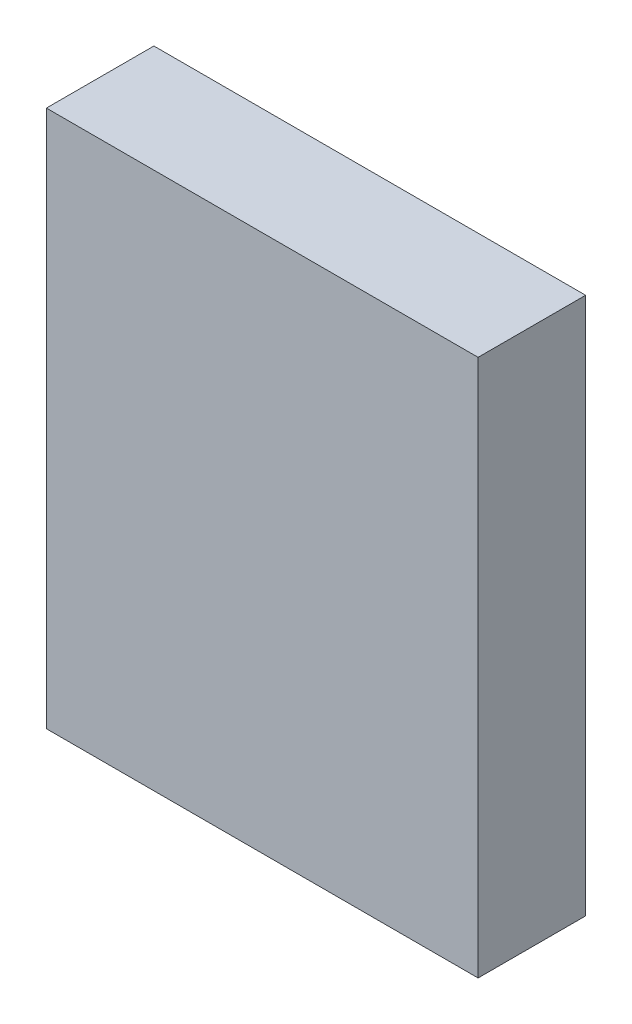
ISO-10303-21;
HEADER;
FILE_DESCRIPTION(('STEP AP214'),'2;1');
FILE_NAME('part.step','',(''),(''),'','','');
FILE_SCHEMA(('AUTOMOTIVE_DESIGN { 1 0 10303 214 1 1 1 1 }'));
ENDSEC;
DATA;
#1=APPLICATION_CONTEXT('core data for automotive mechanical design processes');
#2=APPLICATION_PROTOCOL_DEFINITION('international standard','automotive_design',2000,#1);
#3=PRODUCT_CONTEXT('',#1,'mechanical');
#4=PRODUCT('Part','Part','',(#3));
#5=PRODUCT_RELATED_PRODUCT_CATEGORY('part','',(#4));
#6=PRODUCT_DEFINITION_FORMATION('','',#4);
#7=PRODUCT_DEFINITION_CONTEXT('part definition',#1,'design');
#8=PRODUCT_DEFINITION('design','',#6,#7);
#9=PRODUCT_DEFINITION_SHAPE('','',#8);
#10=(LENGTH_UNIT() NAMED_UNIT(*) SI_UNIT(.MILLI.,.METRE.));
#11=(NAMED_UNIT(*) PLANE_ANGLE_UNIT() SI_UNIT($,.RADIAN.));
#12=(NAMED_UNIT(*) SI_UNIT($,.STERADIAN.) SOLID_ANGLE_UNIT());
#13=UNCERTAINTY_MEASURE_WITH_UNIT(LENGTH_MEASURE(1.E-05),#10,'distance_accuracy_value','');
#14=(GEOMETRIC_REPRESENTATION_CONTEXT(3) GLOBAL_UNCERTAINTY_ASSIGNED_CONTEXT((#13)) GLOBAL_UNIT_ASSIGNED_CONTEXT((#10,
#11,#12)) REPRESENTATION_CONTEXT('',''));
#15=CARTESIAN_POINT('',(0.,0.,0.));
#16=DIRECTION('',(0.,0.,1.));
#17=DIRECTION('',(1.,0.,0.));
#18=AXIS2_PLACEMENT_3D('',#15,#16,#17);
#19=CARTESIAN_POINT('',(-1.53,-1.905003810008,0.762001524003));
#20=DIRECTION('',(0.,0.,1.));
#21=DIRECTION('',(1.,0.,0.));
#22=AXIS2_PLACEMENT_3D('',#19,#20,#21);
#23=PLANE('',#22);
#24=DIRECTION('',(0.,-1.,0.));
#25=VECTOR('',#24,1.);
#26=CARTESIAN_POINT('',(1.53,0.,0.762001524003));
#27=LINE('',#26,#25);
#28=CARTESIAN_POINT('',(1.53,1.905003810008,0.762001524003));
#29=VERTEX_POINT('',#28);
#30=CARTESIAN_POINT('',(1.53,-1.905003810008,0.762001524003));
#31=VERTEX_POINT('',#30);
#32=EDGE_CURVE('E77',#29,#31,#27,.T.);
#33=ORIENTED_EDGE('',*,*,#32,.F.);
#34=DIRECTION('',(1.,0.,0.));
#35=VECTOR('',#34,1.);
#36=CARTESIAN_POINT('',(0.,1.905003810008,0.762001524003));
#37=LINE('',#36,#35);
#38=CARTESIAN_POINT('',(-1.53,1.905003810008,0.762001524003));
#39=VERTEX_POINT('',#38);
#40=EDGE_CURVE('E59',#39,#29,#37,.T.);
#41=ORIENTED_EDGE('',*,*,#40,.F.);
#42=DIRECTION('',(0.,-1.,0.));
#43=VECTOR('',#42,1.);
#44=CARTESIAN_POINT('',(-1.53,0.,0.762001524003));
#45=LINE('',#44,#43);
#46=CARTESIAN_POINT('',(-1.53,-1.905003810008,0.762001524003));
#47=VERTEX_POINT('',#46);
#48=EDGE_CURVE('E21',#39,#47,#45,.T.);
#49=ORIENTED_EDGE('',*,*,#48,.T.);
#50=DIRECTION('',(1.,0.,0.));
#51=VECTOR('',#50,1.);
#52=CARTESIAN_POINT('',(0.,-1.905003810008,0.762001524003));
#53=LINE('',#52,#51);
#54=EDGE_CURVE('E56',#47,#31,#53,.T.);
#55=ORIENTED_EDGE('',*,*,#54,.T.);
#56=EDGE_LOOP('',(#33,#41,#49,#55));
#57=FACE_BOUND('',#56,.T.);
#58=ADVANCED_FACE('F17',(#57),#23,.T.);
#59=CARTESIAN_POINT('',(-1.53,1.905003810008,0.));
#60=DIRECTION('',(1.,0.,0.));
#61=DIRECTION('',(0.,0.,1.));
#62=AXIS2_PLACEMENT_3D('',#59,#60,#61);
#63=PLANE('',#62);
#64=DIRECTION('',(0.,0.,1.));
#65=VECTOR('',#64,1.);
#66=CARTESIAN_POINT('',(-1.53,1.905003810008,0.3810007620015));
#67=LINE('',#66,#65);
#68=CARTESIAN_POINT('',(-1.53,1.905003810008,0.));
#69=VERTEX_POINT('',#68);
#70=EDGE_CURVE('E79',#69,#39,#67,.T.);
#71=ORIENTED_EDGE('',*,*,#70,.F.);
#72=DIRECTION('',(0.,-1.,0.));
#73=VECTOR('',#72,1.);
#74=CARTESIAN_POINT('',(-1.53,0.,0.));
#75=LINE('',#74,#73);
#76=CARTESIAN_POINT('',(-1.53,-1.905003810008,0.));
#77=VERTEX_POINT('',#76);
#78=EDGE_CURVE('E74',#69,#77,#75,.T.);
#79=ORIENTED_EDGE('',*,*,#78,.T.);
#80=DIRECTION('',(0.,0.,1.));
#81=VECTOR('',#80,1.);
#82=CARTESIAN_POINT('',(-1.53,-1.905003810008,0.3810007620015));
#83=LINE('',#82,#81);
#84=EDGE_CURVE('E64',#77,#47,#83,.T.);
#85=ORIENTED_EDGE('',*,*,#84,.T.);
#86=ORIENTED_EDGE('',*,*,#48,.F.);
#87=EDGE_LOOP('',(#71,#79,#85,#86));
#88=FACE_BOUND('',#87,.T.);
#89=ADVANCED_FACE('F73',(#88),#63,.F.);
#90=CARTESIAN_POINT('',(-1.53,-1.905003810008,0.));
#91=DIRECTION('',(0.,1.,0.));
#92=DIRECTION('',(0.,0.,1.));
#93=AXIS2_PLACEMENT_3D('',#90,#91,#92);
#94=PLANE('',#93);
#95=ORIENTED_EDGE('',*,*,#54,.F.);
#96=ORIENTED_EDGE('',*,*,#84,.F.);
#97=DIRECTION('',(1.,0.,0.));
#98=VECTOR('',#97,1.);
#99=CARTESIAN_POINT('',(0.,-1.905003810008,0.));
#100=LINE('',#99,#98);
#101=CARTESIAN_POINT('',(1.53,-1.905003810008,0.));
#102=VERTEX_POINT('',#101);
#103=EDGE_CURVE('E84',#77,#102,#100,.T.);
#104=ORIENTED_EDGE('',*,*,#103,.T.);
#105=DIRECTION('',(0.,0.,-1.));
#106=VECTOR('',#105,1.);
#107=CARTESIAN_POINT('',(1.53,-1.905003810008,0.3810007620015));
#108=LINE('',#107,#106);
#109=EDGE_CURVE('E70',#31,#102,#108,.T.);
#110=ORIENTED_EDGE('',*,*,#109,.F.);
#111=EDGE_LOOP('',(#95,#96,#104,#110));
#112=FACE_BOUND('',#111,.T.);
#113=ADVANCED_FACE('F67',(#112),#94,.F.);
#114=CARTESIAN_POINT('',(1.53,1.905003810008,0.));
#115=DIRECTION('',(1.,0.,0.));
#116=DIRECTION('',(0.,0.,1.));
#117=AXIS2_PLACEMENT_3D('',#114,#115,#116);
#118=PLANE('',#117);
#119=DIRECTION('',(0.,0.,-1.));
#120=VECTOR('',#119,1.);
#121=CARTESIAN_POINT('',(1.53,1.905003810008,0.3810007620015));
#122=LINE('',#121,#120);
#123=CARTESIAN_POINT('',(1.53,1.905003810008,0.));
#124=VERTEX_POINT('',#123);
#125=EDGE_CURVE('E35',#29,#124,#122,.T.);
#126=ORIENTED_EDGE('',*,*,#125,.F.);
#127=ORIENTED_EDGE('',*,*,#32,.T.);
#128=ORIENTED_EDGE('',*,*,#109,.T.);
#129=DIRECTION('',(0.,1.,0.));
#130=VECTOR('',#129,1.);
#131=CARTESIAN_POINT('',(1.53,0.,0.));
#132=LINE('',#131,#130);
#133=EDGE_CURVE('E27',#102,#124,#132,.T.);
#134=ORIENTED_EDGE('',*,*,#133,.T.);
#135=EDGE_LOOP('',(#126,#127,#128,#134));
#136=FACE_BOUND('',#135,.T.);
#137=ADVANCED_FACE('F89',(#136),#118,.T.);
#138=CARTESIAN_POINT('',(-1.53,1.905003810008,0.));
#139=DIRECTION('',(0.,1.,0.));
#140=DIRECTION('',(0.,0.,1.));
#141=AXIS2_PLACEMENT_3D('',#138,#139,#140);
#142=PLANE('',#141);
#143=ORIENTED_EDGE('',*,*,#40,.T.);
#144=ORIENTED_EDGE('',*,*,#125,.T.);
#145=DIRECTION('',(-1.,0.,0.));
#146=VECTOR('',#145,1.);
#147=CARTESIAN_POINT('',(0.,1.905003810008,0.));
#148=LINE('',#147,#146);
#149=EDGE_CURVE('E11',#124,#69,#148,.T.);
#150=ORIENTED_EDGE('',*,*,#149,.T.);
#151=ORIENTED_EDGE('',*,*,#70,.T.);
#152=EDGE_LOOP('',(#143,#144,#150,#151));
#153=FACE_BOUND('',#152,.T.);
#154=ADVANCED_FACE('F91',(#153),#142,.T.);
#155=CARTESIAN_POINT('',(-1.53,-1.905003810008,0.));
#156=DIRECTION('',(0.,0.,1.));
#157=DIRECTION('',(1.,0.,0.));
#158=AXIS2_PLACEMENT_3D('',#155,#156,#157);
#159=PLANE('',#158);
#160=ORIENTED_EDGE('',*,*,#133,.F.);
#161=ORIENTED_EDGE('',*,*,#103,.F.);
#162=ORIENTED_EDGE('',*,*,#78,.F.);
#163=ORIENTED_EDGE('',*,*,#149,.F.);
#164=EDGE_LOOP('',(#160,#161,#162,#163));
#165=FACE_BOUND('',#164,.T.);
#166=ADVANCED_FACE('F19',(#165),#159,.F.);
#167=CLOSED_SHELL('',(#58,#89,#113,#137,#154,#166));
#168=MANIFOLD_SOLID_BREP('B1',#167);
#169=ADVANCED_BREP_SHAPE_REPRESENTATION('',(#18,#168),#14);
#170=SHAPE_DEFINITION_REPRESENTATION(#9,#169);
ENDSEC;
END-ISO-10303-21;
